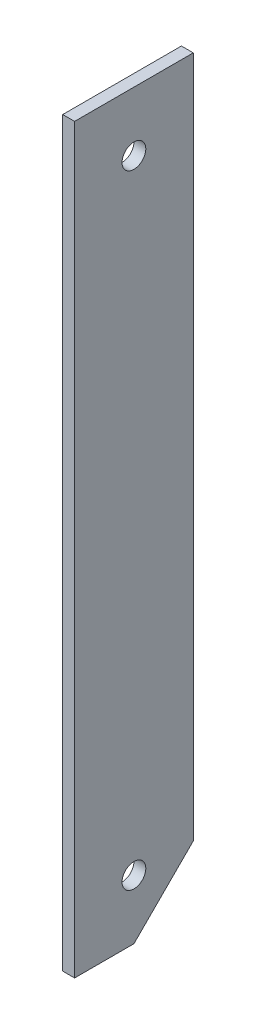
ISO-10303-21;
HEADER;
FILE_DESCRIPTION(('STEP AP214'),'2;1');
FILE_NAME('part.step','',(''),(''),'','','');
FILE_SCHEMA(('AUTOMOTIVE_DESIGN { 1 0 10303 214 1 1 1 1 }'));
ENDSEC;
DATA;
#1=APPLICATION_CONTEXT('core data for automotive mechanical design processes');
#2=APPLICATION_PROTOCOL_DEFINITION('international standard','automotive_design',2000,#1);
#3=PRODUCT_CONTEXT('',#1,'mechanical');
#4=PRODUCT('Part','Part','',(#3));
#5=PRODUCT_RELATED_PRODUCT_CATEGORY('part','',(#4));
#6=PRODUCT_DEFINITION_FORMATION('','',#4);
#7=PRODUCT_DEFINITION_CONTEXT('part definition',#1,'design');
#8=PRODUCT_DEFINITION('design','',#6,#7);
#9=PRODUCT_DEFINITION_SHAPE('','',#8);
#10=(LENGTH_UNIT() NAMED_UNIT(*) SI_UNIT(.MILLI.,.METRE.));
#11=(NAMED_UNIT(*) PLANE_ANGLE_UNIT() SI_UNIT($,.RADIAN.));
#12=(NAMED_UNIT(*) SI_UNIT($,.STERADIAN.) SOLID_ANGLE_UNIT());
#13=UNCERTAINTY_MEASURE_WITH_UNIT(LENGTH_MEASURE(1.E-05),#10,'distance_accuracy_value','');
#14=(GEOMETRIC_REPRESENTATION_CONTEXT(3) GLOBAL_UNCERTAINTY_ASSIGNED_CONTEXT((#13)) GLOBAL_UNIT_ASSIGNED_CONTEXT((#10,
#11,#12)) REPRESENTATION_CONTEXT('',''));
#15=CARTESIAN_POINT('',(0.,0.,0.));
#16=DIRECTION('',(0.,0.,1.));
#17=DIRECTION('',(1.,0.,0.));
#18=AXIS2_PLACEMENT_3D('',#15,#16,#17);
#19=CARTESIAN_POINT('',(4.,0.,0.));
#20=DIRECTION('',(1.,0.,0.));
#21=DIRECTION('',(0.,0.,-1.));
#22=AXIS2_PLACEMENT_3D('',#19,#20,#21);
#23=PLANE('',#22);
#24=CARTESIAN_POINT('',(4.,105.,0.));
#25=DIRECTION('',(1.,0.,0.));
#26=DIRECTION('',(0.,0.,-1.));
#27=AXIS2_PLACEMENT_3D('',#24,#25,#26);
#28=CIRCLE('',#27,4.00000000000001);
#29=CARTESIAN_POINT('',(4.,105.,-3.99999999999998));
#30=VERTEX_POINT('',#29);
#31=EDGE_CURVE('E140',#30,#30,#28,.T.);
#32=ORIENTED_EDGE('',*,*,#31,.F.);
#33=EDGE_LOOP('',(#32));
#34=FACE_BOUND('',#33,.T.);
#35=DIRECTION('',(0.,0.,-1.));
#36=VECTOR('',#35,1.);
#37=CARTESIAN_POINT('',(4.,-125.,20.));
#38=LINE('',#37,#36);
#39=CARTESIAN_POINT('',(4.,-125.,20.));
#40=VERTEX_POINT('',#39);
#41=CARTESIAN_POINT('',(4.,-125.,0.));
#42=VERTEX_POINT('',#41);
#43=EDGE_CURVE('E129',#40,#42,#38,.T.);
#44=ORIENTED_EDGE('',*,*,#43,.T.);
#45=DIRECTION('',(0.,-0.707106781186546,0.707106781186549));
#46=VECTOR('',#45,1.);
#47=CARTESIAN_POINT('',(4.,-62.5000000000002,-62.4999999999999));
#48=LINE('',#47,#46);
#49=CARTESIAN_POINT('',(4.,-105.,-20.));
#50=VERTEX_POINT('',#49);
#51=EDGE_CURVE('E11',#42,#50,#48,.F.);
#52=ORIENTED_EDGE('',*,*,#51,.T.);
#53=DIRECTION('',(0.,1.,0.));
#54=VECTOR('',#53,1.);
#55=CARTESIAN_POINT('',(4.,125.,-20.));
#56=LINE('',#55,#54);
#57=CARTESIAN_POINT('',(4.,125.,-20.));
#58=VERTEX_POINT('',#57);
#59=EDGE_CURVE('E88',#50,#58,#56,.T.);
#60=ORIENTED_EDGE('',*,*,#59,.T.);
#61=DIRECTION('',(0.,0.,1.));
#62=VECTOR('',#61,1.);
#63=CARTESIAN_POINT('',(4.,125.,20.));
#64=LINE('',#63,#62);
#65=CARTESIAN_POINT('',(4.,125.,20.));
#66=VERTEX_POINT('',#65);
#67=EDGE_CURVE('E91',#58,#66,#64,.T.);
#68=ORIENTED_EDGE('',*,*,#67,.T.);
#69=DIRECTION('',(0.,-1.,0.));
#70=VECTOR('',#69,1.);
#71=CARTESIAN_POINT('',(4.,125.,20.));
#72=LINE('',#71,#70);
#73=EDGE_CURVE('E109',#66,#40,#72,.T.);
#74=ORIENTED_EDGE('',*,*,#73,.T.);
#75=EDGE_LOOP('',(#44,#52,#60,#68,#74));
#76=FACE_BOUND('',#75,.T.);
#77=CARTESIAN_POINT('',(4.,-105.,0.));
#78=DIRECTION('',(1.,0.,0.));
#79=DIRECTION('',(0.,0.,-1.));
#80=AXIS2_PLACEMENT_3D('',#77,#78,#79);
#81=CIRCLE('',#80,4.00000000000001);
#82=CARTESIAN_POINT('',(4.,-105.,-4.00000000000004));
#83=VERTEX_POINT('',#82);
#84=EDGE_CURVE('E149',#83,#83,#81,.T.);
#85=ORIENTED_EDGE('',*,*,#84,.F.);
#86=EDGE_LOOP('',(#85));
#87=FACE_BOUND('',#86,.T.);
#88=ADVANCED_FACE('F41',(#34,#76,#87),#23,.T.);
#89=CARTESIAN_POINT('',(0.,0.,0.));
#90=DIRECTION('',(1.,0.,0.));
#91=DIRECTION('',(0.,0.,-1.));
#92=AXIS2_PLACEMENT_3D('',#89,#90,#91);
#93=PLANE('',#92);
#94=DIRECTION('',(0.,1.,0.));
#95=VECTOR('',#94,1.);
#96=CARTESIAN_POINT('',(0.,125.,-20.));
#97=LINE('',#96,#95);
#98=CARTESIAN_POINT('',(0.,-105.,-20.));
#99=VERTEX_POINT('',#98);
#100=CARTESIAN_POINT('',(0.,125.,-20.));
#101=VERTEX_POINT('',#100);
#102=EDGE_CURVE('E112',#99,#101,#97,.T.);
#103=ORIENTED_EDGE('',*,*,#102,.F.);
#104=DIRECTION('',(0.,0.707106781186546,-0.707106781186549));
#105=VECTOR('',#104,1.);
#106=CARTESIAN_POINT('',(0.,-105.,-20.));
#107=LINE('',#106,#105);
#108=CARTESIAN_POINT('',(0.,-125.,0.));
#109=VERTEX_POINT('',#108);
#110=EDGE_CURVE('E64',#99,#109,#107,.F.);
#111=ORIENTED_EDGE('',*,*,#110,.T.);
#112=DIRECTION('',(0.,0.,-1.));
#113=VECTOR('',#112,1.);
#114=CARTESIAN_POINT('',(0.,-125.,20.));
#115=LINE('',#114,#113);
#116=CARTESIAN_POINT('',(0.,-125.,20.));
#117=VERTEX_POINT('',#116);
#118=EDGE_CURVE('E99',#117,#109,#115,.T.);
#119=ORIENTED_EDGE('',*,*,#118,.F.);
#120=DIRECTION('',(0.,-1.,0.));
#121=VECTOR('',#120,1.);
#122=CARTESIAN_POINT('',(0.,125.,20.));
#123=LINE('',#122,#121);
#124=CARTESIAN_POINT('',(0.,125.,20.));
#125=VERTEX_POINT('',#124);
#126=EDGE_CURVE('E132',#125,#117,#123,.T.);
#127=ORIENTED_EDGE('',*,*,#126,.F.);
#128=DIRECTION('',(0.,0.,1.));
#129=VECTOR('',#128,1.);
#130=CARTESIAN_POINT('',(0.,125.,20.));
#131=LINE('',#130,#129);
#132=EDGE_CURVE('E135',#101,#125,#131,.T.);
#133=ORIENTED_EDGE('',*,*,#132,.F.);
#134=EDGE_LOOP('',(#103,#111,#119,#127,#133));
#135=FACE_BOUND('',#134,.T.);
#136=CARTESIAN_POINT('',(0.,105.,0.));
#137=DIRECTION('',(1.,0.,0.));
#138=DIRECTION('',(0.,0.,-1.));
#139=AXIS2_PLACEMENT_3D('',#136,#137,#138);
#140=CIRCLE('',#139,4.00000000000001);
#141=CARTESIAN_POINT('',(0.,105.,-3.99999999999998));
#142=VERTEX_POINT('',#141);
#143=EDGE_CURVE('E145',#142,#142,#140,.T.);
#144=ORIENTED_EDGE('',*,*,#143,.T.);
#145=EDGE_LOOP('',(#144));
#146=FACE_BOUND('',#145,.T.);
#147=CARTESIAN_POINT('',(0.,-105.,0.));
#148=DIRECTION('',(1.,0.,0.));
#149=DIRECTION('',(0.,0.,-1.));
#150=AXIS2_PLACEMENT_3D('',#147,#148,#149);
#151=CIRCLE('',#150,4.00000000000001);
#152=CARTESIAN_POINT('',(0.,-105.,-4.00000000000004));
#153=VERTEX_POINT('',#152);
#154=EDGE_CURVE('E153',#153,#153,#151,.T.);
#155=ORIENTED_EDGE('',*,*,#154,.T.);
#156=EDGE_LOOP('',(#155));
#157=FACE_BOUND('',#156,.T.);
#158=ADVANCED_FACE('F164',(#135,#146,#157),#93,.F.);
#159=CARTESIAN_POINT('',(4.,125.,-20.));
#160=DIRECTION('',(0.,0.,1.));
#161=DIRECTION('',(0.,-1.,0.));
#162=AXIS2_PLACEMENT_3D('',#159,#160,#161);
#163=PLANE('',#162);
#164=ORIENTED_EDGE('',*,*,#59,.F.);
#165=DIRECTION('',(-1.,0.,0.));
#166=VECTOR('',#165,1.);
#167=CARTESIAN_POINT('',(4.,-105.,-20.));
#168=LINE('',#167,#166);
#169=EDGE_CURVE('E115',#50,#99,#168,.T.);
#170=ORIENTED_EDGE('',*,*,#169,.T.);
#171=ORIENTED_EDGE('',*,*,#102,.T.);
#172=DIRECTION('',(-1.,0.,0.));
#173=VECTOR('',#172,1.);
#174=CARTESIAN_POINT('',(4.,125.,-20.));
#175=LINE('',#174,#173);
#176=EDGE_CURVE('E104',#58,#101,#175,.T.);
#177=ORIENTED_EDGE('',*,*,#176,.F.);
#178=EDGE_LOOP('',(#164,#170,#171,#177));
#179=FACE_BOUND('',#178,.T.);
#180=ADVANCED_FACE('F111',(#179),#163,.F.);
#181=CARTESIAN_POINT('',(4.,125.,20.));
#182=DIRECTION('',(0.,-1.,0.));
#183=DIRECTION('',(0.,0.,-1.));
#184=AXIS2_PLACEMENT_3D('',#181,#182,#183);
#185=PLANE('',#184);
#186=ORIENTED_EDGE('',*,*,#132,.T.);
#187=DIRECTION('',(-1.,0.,0.));
#188=VECTOR('',#187,1.);
#189=CARTESIAN_POINT('',(4.,125.,20.));
#190=LINE('',#189,#188);
#191=EDGE_CURVE('E106',#66,#125,#190,.T.);
#192=ORIENTED_EDGE('',*,*,#191,.F.);
#193=ORIENTED_EDGE('',*,*,#67,.F.);
#194=ORIENTED_EDGE('',*,*,#176,.T.);
#195=EDGE_LOOP('',(#186,#192,#193,#194));
#196=FACE_BOUND('',#195,.T.);
#197=ADVANCED_FACE('F103',(#196),#185,.F.);
#198=CARTESIAN_POINT('',(4.,125.,20.));
#199=DIRECTION('',(0.,0.,-1.));
#200=DIRECTION('',(0.,1.,0.));
#201=AXIS2_PLACEMENT_3D('',#198,#199,#200);
#202=PLANE('',#201);
#203=ORIENTED_EDGE('',*,*,#126,.T.);
#204=DIRECTION('',(-1.,0.,0.));
#205=VECTOR('',#204,1.);
#206=CARTESIAN_POINT('',(4.,-125.,20.));
#207=LINE('',#206,#205);
#208=EDGE_CURVE('E120',#40,#117,#207,.T.);
#209=ORIENTED_EDGE('',*,*,#208,.F.);
#210=ORIENTED_EDGE('',*,*,#73,.F.);
#211=ORIENTED_EDGE('',*,*,#191,.T.);
#212=EDGE_LOOP('',(#203,#209,#210,#211));
#213=FACE_BOUND('',#212,.T.);
#214=ADVANCED_FACE('F179',(#213),#202,.F.);
#215=CARTESIAN_POINT('',(4.,-125.,20.));
#216=DIRECTION('',(0.,1.,0.));
#217=DIRECTION('',(0.,0.,1.));
#218=AXIS2_PLACEMENT_3D('',#215,#216,#217);
#219=PLANE('',#218);
#220=ORIENTED_EDGE('',*,*,#118,.T.);
#221=DIRECTION('',(1.,0.,0.));
#222=VECTOR('',#221,1.);
#223=CARTESIAN_POINT('',(4.,-125.,0.));
#224=LINE('',#223,#222);
#225=EDGE_CURVE('E50',#109,#42,#224,.T.);
#226=ORIENTED_EDGE('',*,*,#225,.T.);
#227=ORIENTED_EDGE('',*,*,#43,.F.);
#228=ORIENTED_EDGE('',*,*,#208,.T.);
#229=EDGE_LOOP('',(#220,#226,#227,#228));
#230=FACE_BOUND('',#229,.T.);
#231=ADVANCED_FACE('F176',(#230),#219,.F.);
#232=CARTESIAN_POINT('',(4.,105.,0.));
#233=DIRECTION('',(-1.,0.,0.));
#234=DIRECTION('',(0.,0.,1.));
#235=AXIS2_PLACEMENT_3D('',#232,#233,#234);
#236=CYLINDRICAL_SURFACE('',#235,4.00000000000001);
#237=ORIENTED_EDGE('',*,*,#31,.T.);
#238=EDGE_LOOP('',(#237));
#239=FACE_BOUND('',#238,.T.);
#240=ORIENTED_EDGE('',*,*,#143,.F.);
#241=EDGE_LOOP('',(#240));
#242=FACE_BOUND('',#241,.T.);
#243=ADVANCED_FACE('F173',(#239,#242),#236,.F.);
#244=CARTESIAN_POINT('',(4.,-105.,0.));
#245=DIRECTION('',(-1.,0.,0.));
#246=DIRECTION('',(0.,0.,1.));
#247=AXIS2_PLACEMENT_3D('',#244,#245,#246);
#248=CYLINDRICAL_SURFACE('',#247,4.00000000000001);
#249=ORIENTED_EDGE('',*,*,#84,.T.);
#250=EDGE_LOOP('',(#249));
#251=FACE_BOUND('',#250,.T.);
#252=ORIENTED_EDGE('',*,*,#154,.F.);
#253=EDGE_LOOP('',(#252));
#254=FACE_BOUND('',#253,.T.);
#255=ADVANCED_FACE('F161',(#251,#254),#248,.F.);
#256=CARTESIAN_POINT('',(4.,-105.,-20.));
#257=DIRECTION('',(0.,0.707106781186549,0.707106781186546));
#258=DIRECTION('',(-1.,0.,0.));
#259=AXIS2_PLACEMENT_3D('',#256,#257,#258);
#260=PLANE('',#259);
#261=ORIENTED_EDGE('',*,*,#51,.F.);
#262=ORIENTED_EDGE('',*,*,#225,.F.);
#263=ORIENTED_EDGE('',*,*,#110,.F.);
#264=ORIENTED_EDGE('',*,*,#169,.F.);
#265=EDGE_LOOP('',(#261,#262,#263,#264));
#266=FACE_BOUND('',#265,.T.);
#267=ADVANCED_FACE('F43',(#266),#260,.F.);
#268=CLOSED_SHELL('',(#88,#158,#180,#197,#214,#231,#243,#255,#267));
#269=MANIFOLD_SOLID_BREP('B2',#268);
#270=ADVANCED_BREP_SHAPE_REPRESENTATION('',(#18,#269),#14);
#271=SHAPE_DEFINITION_REPRESENTATION(#9,#270);
ENDSEC;
END-ISO-10303-21;
